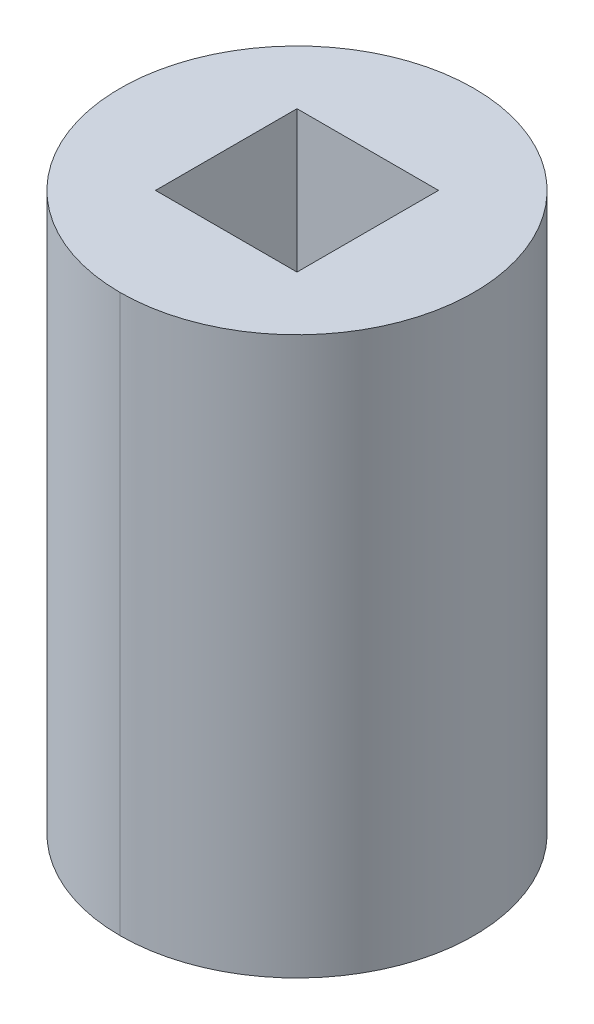
ISO-10303-21;
HEADER;
FILE_DESCRIPTION(('STEP AP214'),'2;1');
FILE_NAME('part.step','',(''),(''),'','','');
FILE_SCHEMA(('AUTOMOTIVE_DESIGN { 1 0 10303 214 1 1 1 1 }'));
ENDSEC;
DATA;
#1=APPLICATION_CONTEXT('core data for automotive mechanical design processes');
#2=APPLICATION_PROTOCOL_DEFINITION('international standard','automotive_design',2000,#1);
#3=PRODUCT_CONTEXT('',#1,'mechanical');
#4=PRODUCT('Part','Part','',(#3));
#5=PRODUCT_RELATED_PRODUCT_CATEGORY('part','',(#4));
#6=PRODUCT_DEFINITION_FORMATION('','',#4);
#7=PRODUCT_DEFINITION_CONTEXT('part definition',#1,'design');
#8=PRODUCT_DEFINITION('design','',#6,#7);
#9=PRODUCT_DEFINITION_SHAPE('','',#8);
#10=(LENGTH_UNIT() NAMED_UNIT(*) SI_UNIT(.MILLI.,.METRE.));
#11=(NAMED_UNIT(*) PLANE_ANGLE_UNIT() SI_UNIT($,.RADIAN.));
#12=(NAMED_UNIT(*) SI_UNIT($,.STERADIAN.) SOLID_ANGLE_UNIT());
#13=UNCERTAINTY_MEASURE_WITH_UNIT(LENGTH_MEASURE(1.E-05),#10,'distance_accuracy_value','');
#14=(GEOMETRIC_REPRESENTATION_CONTEXT(3) GLOBAL_UNCERTAINTY_ASSIGNED_CONTEXT((#13)) GLOBAL_UNIT_ASSIGNED_CONTEXT((#10,
#11,#12)) REPRESENTATION_CONTEXT('',''));
#15=CARTESIAN_POINT('',(0.,0.,0.));
#16=DIRECTION('',(0.,0.,1.));
#17=DIRECTION('',(1.,0.,0.));
#18=AXIS2_PLACEMENT_3D('',#15,#16,#17);
#19=CARTESIAN_POINT('',(-9.01699999999987,2.4,3.81));
#20=DIRECTION('',(0.,1.,0.));
#21=DIRECTION('',(0.,0.,1.));
#22=AXIS2_PLACEMENT_3D('',#19,#20,#21);
#23=CYLINDRICAL_SURFACE('',#22,0.635);
#24=CARTESIAN_POINT('',(-9.01699999999987,2.4,3.81));
#25=DIRECTION('',(0.,1.,0.));
#26=DIRECTION('',(0.,0.,1.));
#27=AXIS2_PLACEMENT_3D('',#24,#25,#26);
#28=CIRCLE('',#27,0.635);
#29=CARTESIAN_POINT('',(-9.01699999999987,2.4,4.445));
#30=VERTEX_POINT('',#29);
#31=CARTESIAN_POINT('',(-9.01699999999987,2.4,3.175));
#32=VERTEX_POINT('',#31);
#33=EDGE_CURVE('E11',#30,#32,#28,.T.);
#34=ORIENTED_EDGE('',*,*,#33,.T.);
#35=DIRECTION('',(0.,1.,0.));
#36=VECTOR('',#35,1.);
#37=CARTESIAN_POINT('',(-9.01699999999987,2.4,3.175));
#38=LINE('',#37,#36);
#39=CARTESIAN_POINT('',(-9.01699999999987,4.4,3.175));
#40=VERTEX_POINT('',#39);
#41=EDGE_CURVE('E24',#32,#40,#38,.T.);
#42=ORIENTED_EDGE('',*,*,#41,.T.);
#43=CARTESIAN_POINT('',(-9.01699999999987,4.4,3.81));
#44=DIRECTION('',(0.,1.,0.));
#45=DIRECTION('',(0.,0.,1.));
#46=AXIS2_PLACEMENT_3D('',#43,#44,#45);
#47=CIRCLE('',#46,0.635);
#48=CARTESIAN_POINT('',(-9.01699999999987,4.4,4.445));
#49=VERTEX_POINT('',#48);
#50=EDGE_CURVE('E117',#49,#40,#47,.T.);
#51=ORIENTED_EDGE('',*,*,#50,.F.);
#52=DIRECTION('',(0.,1.,0.));
#53=VECTOR('',#52,1.);
#54=CARTESIAN_POINT('',(-9.01699999999987,2.4,4.445));
#55=LINE('',#54,#53);
#56=EDGE_CURVE('E114',#30,#49,#55,.T.);
#57=ORIENTED_EDGE('',*,*,#56,.F.);
#58=EDGE_LOOP('',(#34,#42,#51,#57));
#59=FACE_BOUND('',#58,.T.);
#60=ADVANCED_FACE('F17',(#59),#23,.T.);
#61=CARTESIAN_POINT('',(-9.01699999999987,2.4,3.81));
#62=DIRECTION('',(0.,1.,0.));
#63=DIRECTION('',(0.,0.,1.));
#64=AXIS2_PLACEMENT_3D('',#61,#62,#63);
#65=CYLINDRICAL_SURFACE('',#64,0.635);
#66=ORIENTED_EDGE('',*,*,#41,.F.);
#67=CARTESIAN_POINT('',(-9.01699999999987,2.4,3.81));
#68=DIRECTION('',(0.,1.,0.));
#69=DIRECTION('',(0.,0.,1.));
#70=AXIS2_PLACEMENT_3D('',#67,#68,#69);
#71=CIRCLE('',#70,0.635);
#72=EDGE_CURVE('E111',#32,#30,#71,.T.);
#73=ORIENTED_EDGE('',*,*,#72,.T.);
#74=ORIENTED_EDGE('',*,*,#56,.T.);
#75=CARTESIAN_POINT('',(-9.01699999999987,4.4,3.81));
#76=DIRECTION('',(0.,1.,0.));
#77=DIRECTION('',(0.,0.,1.));
#78=AXIS2_PLACEMENT_3D('',#75,#76,#77);
#79=CIRCLE('',#78,0.635);
#80=EDGE_CURVE('E108',#40,#49,#79,.T.);
#81=ORIENTED_EDGE('',*,*,#80,.F.);
#82=EDGE_LOOP('',(#66,#73,#74,#81));
#83=FACE_BOUND('',#82,.T.);
#84=ADVANCED_FACE('F121',(#83),#65,.T.);
#85=CARTESIAN_POINT('',(-9.01699999999987,2.4,3.81));
#86=DIRECTION('',(0.,1.,0.));
#87=DIRECTION('',(0.,0.,1.));
#88=AXIS2_PLACEMENT_3D('',#85,#86,#87);
#89=PLANE('',#88);
#90=DIRECTION('',(0.,0.,1.));
#91=VECTOR('',#90,1.);
#92=CARTESIAN_POINT('',(-9.27099999999987,2.4,3.556));
#93=LINE('',#92,#91);
#94=CARTESIAN_POINT('',(-9.27099999999987,2.4,3.556));
#95=VERTEX_POINT('',#94);
#96=CARTESIAN_POINT('',(-9.27099999999987,2.4,4.064));
#97=VERTEX_POINT('',#96);
#98=EDGE_CURVE('E106',#95,#97,#93,.T.);
#99=ORIENTED_EDGE('',*,*,#98,.T.);
#100=DIRECTION('',(1.,0.,0.));
#101=VECTOR('',#100,1.);
#102=CARTESIAN_POINT('',(-9.27099999999987,2.4,4.064));
#103=LINE('',#102,#101);
#104=CARTESIAN_POINT('',(-8.76299999999987,2.4,4.064));
#105=VERTEX_POINT('',#104);
#106=EDGE_CURVE('E104',#97,#105,#103,.T.);
#107=ORIENTED_EDGE('',*,*,#106,.T.);
#108=DIRECTION('',(0.,0.,-1.));
#109=VECTOR('',#108,1.);
#110=CARTESIAN_POINT('',(-8.76299999999987,2.4,4.064));
#111=LINE('',#110,#109);
#112=CARTESIAN_POINT('',(-8.76299999999987,2.4,3.556));
#113=VERTEX_POINT('',#112);
#114=EDGE_CURVE('E102',#105,#113,#111,.T.);
#115=ORIENTED_EDGE('',*,*,#114,.T.);
#116=DIRECTION('',(-1.,0.,0.));
#117=VECTOR('',#116,1.);
#118=CARTESIAN_POINT('',(-8.76299999999987,2.4,3.556));
#119=LINE('',#118,#117);
#120=EDGE_CURVE('E89',#113,#95,#119,.T.);
#121=ORIENTED_EDGE('',*,*,#120,.T.);
#122=EDGE_LOOP('',(#99,#107,#115,#121));
#123=FACE_BOUND('',#122,.T.);
#124=ORIENTED_EDGE('',*,*,#33,.F.);
#125=ORIENTED_EDGE('',*,*,#72,.F.);
#126=EDGE_LOOP('',(#124,#125));
#127=FACE_BOUND('',#126,.T.);
#128=ADVANCED_FACE('F122',(#123,#127),#89,.F.);
#129=CARTESIAN_POINT('',(-9.01699999999987,4.4,3.81));
#130=DIRECTION('',(0.,1.,0.));
#131=DIRECTION('',(0.,0.,1.));
#132=AXIS2_PLACEMENT_3D('',#129,#130,#131);
#133=PLANE('',#132);
#134=DIRECTION('',(1.,0.,0.));
#135=VECTOR('',#134,1.);
#136=CARTESIAN_POINT('',(-9.27099999999987,4.4,4.064));
#137=LINE('',#136,#135);
#138=CARTESIAN_POINT('',(-9.27099999999987,4.4,4.064));
#139=VERTEX_POINT('',#138);
#140=CARTESIAN_POINT('',(-8.76299999999987,4.4,4.064));
#141=VERTEX_POINT('',#140);
#142=EDGE_CURVE('E99',#139,#141,#137,.T.);
#143=ORIENTED_EDGE('',*,*,#142,.F.);
#144=DIRECTION('',(0.,0.,1.));
#145=VECTOR('',#144,1.);
#146=CARTESIAN_POINT('',(-9.27099999999987,4.4,3.556));
#147=LINE('',#146,#145);
#148=CARTESIAN_POINT('',(-9.27099999999987,4.4,3.556));
#149=VERTEX_POINT('',#148);
#150=EDGE_CURVE('E72',#149,#139,#147,.T.);
#151=ORIENTED_EDGE('',*,*,#150,.F.);
#152=DIRECTION('',(-1.,0.,0.));
#153=VECTOR('',#152,1.);
#154=CARTESIAN_POINT('',(-8.76299999999987,4.4,3.556));
#155=LINE('',#154,#153);
#156=CARTESIAN_POINT('',(-8.76299999999987,4.4,3.556));
#157=VERTEX_POINT('',#156);
#158=EDGE_CURVE('E65',#157,#149,#155,.T.);
#159=ORIENTED_EDGE('',*,*,#158,.F.);
#160=DIRECTION('',(0.,0.,-1.));
#161=VECTOR('',#160,1.);
#162=CARTESIAN_POINT('',(-8.76299999999987,4.4,4.064));
#163=LINE('',#162,#161);
#164=EDGE_CURVE('E69',#141,#157,#163,.T.);
#165=ORIENTED_EDGE('',*,*,#164,.F.);
#166=EDGE_LOOP('',(#143,#151,#159,#165));
#167=FACE_BOUND('',#166,.T.);
#168=ORIENTED_EDGE('',*,*,#50,.T.);
#169=ORIENTED_EDGE('',*,*,#80,.T.);
#170=EDGE_LOOP('',(#168,#169));
#171=FACE_BOUND('',#170,.T.);
#172=ADVANCED_FACE('F67',(#167,#171),#133,.T.);
#173=CARTESIAN_POINT('',(-9.27099999999987,2.4,4.064));
#174=DIRECTION('',(0.,0.,1.));
#175=DIRECTION('',(1.,0.,0.));
#176=AXIS2_PLACEMENT_3D('',#173,#174,#175);
#177=PLANE('',#176);
#178=ORIENTED_EDGE('',*,*,#142,.T.);
#179=DIRECTION('',(0.,1.,0.));
#180=VECTOR('',#179,1.);
#181=CARTESIAN_POINT('',(-8.76299999999987,2.4,4.064));
#182=LINE('',#181,#180);
#183=EDGE_CURVE('E84',#105,#141,#182,.T.);
#184=ORIENTED_EDGE('',*,*,#183,.F.);
#185=ORIENTED_EDGE('',*,*,#106,.F.);
#186=DIRECTION('',(0.,1.,0.));
#187=VECTOR('',#186,1.);
#188=CARTESIAN_POINT('',(-9.27099999999987,2.4,4.064));
#189=LINE('',#188,#187);
#190=EDGE_CURVE('E92',#97,#139,#189,.T.);
#191=ORIENTED_EDGE('',*,*,#190,.T.);
#192=EDGE_LOOP('',(#178,#184,#185,#191));
#193=FACE_BOUND('',#192,.T.);
#194=ADVANCED_FACE('F131',(#193),#177,.F.);
#195=CARTESIAN_POINT('',(-9.27099999999987,2.4,3.556));
#196=DIRECTION('',(-1.,0.,0.));
#197=DIRECTION('',(0.,0.,1.));
#198=AXIS2_PLACEMENT_3D('',#195,#196,#197);
#199=PLANE('',#198);
#200=ORIENTED_EDGE('',*,*,#150,.T.);
#201=ORIENTED_EDGE('',*,*,#190,.F.);
#202=ORIENTED_EDGE('',*,*,#98,.F.);
#203=DIRECTION('',(0.,1.,0.));
#204=VECTOR('',#203,1.);
#205=CARTESIAN_POINT('',(-9.27099999999987,2.4,3.556));
#206=LINE('',#205,#204);
#207=EDGE_CURVE('E90',#95,#149,#206,.T.);
#208=ORIENTED_EDGE('',*,*,#207,.T.);
#209=EDGE_LOOP('',(#200,#201,#202,#208));
#210=FACE_BOUND('',#209,.T.);
#211=ADVANCED_FACE('F164',(#210),#199,.F.);
#212=CARTESIAN_POINT('',(-8.76299999999987,2.4,3.556));
#213=DIRECTION('',(0.,0.,-1.));
#214=DIRECTION('',(-1.,0.,0.));
#215=AXIS2_PLACEMENT_3D('',#212,#213,#214);
#216=PLANE('',#215);
#217=ORIENTED_EDGE('',*,*,#158,.T.);
#218=ORIENTED_EDGE('',*,*,#207,.F.);
#219=ORIENTED_EDGE('',*,*,#120,.F.);
#220=DIRECTION('',(0.,1.,0.));
#221=VECTOR('',#220,1.);
#222=CARTESIAN_POINT('',(-8.76299999999987,2.4,3.556));
#223=LINE('',#222,#221);
#224=EDGE_CURVE('E82',#113,#157,#223,.T.);
#225=ORIENTED_EDGE('',*,*,#224,.T.);
#226=EDGE_LOOP('',(#217,#218,#219,#225));
#227=FACE_BOUND('',#226,.T.);
#228=ADVANCED_FACE('F87',(#227),#216,.F.);
#229=CARTESIAN_POINT('',(-8.76299999999987,2.4,4.064));
#230=DIRECTION('',(1.,0.,0.));
#231=DIRECTION('',(0.,0.,-1.));
#232=AXIS2_PLACEMENT_3D('',#229,#230,#231);
#233=PLANE('',#232);
#234=ORIENTED_EDGE('',*,*,#164,.T.);
#235=ORIENTED_EDGE('',*,*,#224,.F.);
#236=ORIENTED_EDGE('',*,*,#114,.F.);
#237=ORIENTED_EDGE('',*,*,#183,.T.);
#238=EDGE_LOOP('',(#234,#235,#236,#237));
#239=FACE_BOUND('',#238,.T.);
#240=ADVANCED_FACE('F80',(#239),#233,.F.);
#241=CLOSED_SHELL('',(#60,#84,#128,#172,#194,#211,#228,#240));
#242=MANIFOLD_SOLID_BREP('B1',#241);
#243=ADVANCED_BREP_SHAPE_REPRESENTATION('',(#18,#242),#14);
#244=SHAPE_DEFINITION_REPRESENTATION(#9,#243);
ENDSEC;
END-ISO-10303-21;
